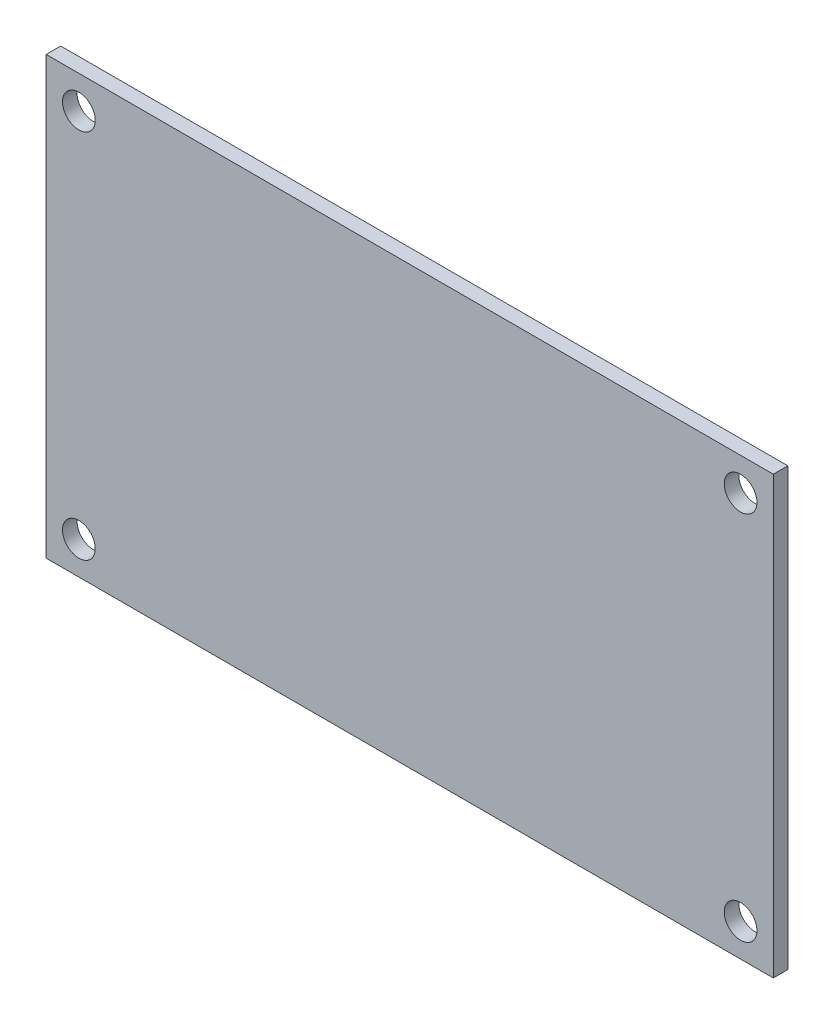
ISO-10303-21;
HEADER;
FILE_DESCRIPTION(('STEP AP214'),'2;1');
FILE_NAME('part.step','',(''),(''),'','','');
FILE_SCHEMA(('AUTOMOTIVE_DESIGN { 1 0 10303 214 1 1 1 1 }'));
ENDSEC;
DATA;
#1=APPLICATION_CONTEXT('core data for automotive mechanical design processes');
#2=APPLICATION_PROTOCOL_DEFINITION('international standard','automotive_design',2000,#1);
#3=PRODUCT_CONTEXT('',#1,'mechanical');
#4=PRODUCT('Part','Part','',(#3));
#5=PRODUCT_RELATED_PRODUCT_CATEGORY('part','',(#4));
#6=PRODUCT_DEFINITION_FORMATION('','',#4);
#7=PRODUCT_DEFINITION_CONTEXT('part definition',#1,'design');
#8=PRODUCT_DEFINITION('design','',#6,#7);
#9=PRODUCT_DEFINITION_SHAPE('','',#8);
#10=(LENGTH_UNIT() NAMED_UNIT(*) SI_UNIT(.MILLI.,.METRE.));
#11=(NAMED_UNIT(*) PLANE_ANGLE_UNIT() SI_UNIT($,.RADIAN.));
#12=(NAMED_UNIT(*) SI_UNIT($,.STERADIAN.) SOLID_ANGLE_UNIT());
#13=UNCERTAINTY_MEASURE_WITH_UNIT(LENGTH_MEASURE(1.E-05),#10,'distance_accuracy_value','');
#14=(GEOMETRIC_REPRESENTATION_CONTEXT(3) GLOBAL_UNCERTAINTY_ASSIGNED_CONTEXT((#13)) GLOBAL_UNIT_ASSIGNED_CONTEXT((#10,
#11,#12)) REPRESENTATION_CONTEXT('',''));
#15=CARTESIAN_POINT('',(0.,0.,0.));
#16=DIRECTION('',(0.,0.,1.));
#17=DIRECTION('',(1.,0.,0.));
#18=AXIS2_PLACEMENT_3D('',#15,#16,#17);
#19=CARTESIAN_POINT('',(-50.,30.,2.));
#20=DIRECTION('',(1.,0.,0.));
#21=DIRECTION('',(0.,0.,-1.));
#22=AXIS2_PLACEMENT_3D('',#19,#20,#21);
#23=PLANE('',#22);
#24=DIRECTION('',(0.,-1.,0.));
#25=VECTOR('',#24,1.);
#26=CARTESIAN_POINT('',(-50.,30.,0.));
#27=LINE('',#26,#25);
#28=CARTESIAN_POINT('',(-50.,30.,0.));
#29=VERTEX_POINT('',#28);
#30=CARTESIAN_POINT('',(-50.,-30.,0.));
#31=VERTEX_POINT('',#30);
#32=EDGE_CURVE('E100',#29,#31,#27,.T.);
#33=ORIENTED_EDGE('',*,*,#32,.T.);
#34=DIRECTION('',(0.,0.,-1.));
#35=VECTOR('',#34,1.);
#36=CARTESIAN_POINT('',(-50.,-30.,2.));
#37=LINE('',#36,#35);
#38=CARTESIAN_POINT('',(-50.,-30.,2.));
#39=VERTEX_POINT('',#38);
#40=EDGE_CURVE('E11',#39,#31,#37,.T.);
#41=ORIENTED_EDGE('',*,*,#40,.F.);
#42=DIRECTION('',(0.,-1.,0.));
#43=VECTOR('',#42,1.);
#44=CARTESIAN_POINT('',(-50.,30.,2.));
#45=LINE('',#44,#43);
#46=CARTESIAN_POINT('',(-50.,30.,2.));
#47=VERTEX_POINT('',#46);
#48=EDGE_CURVE('E86',#47,#39,#45,.T.);
#49=ORIENTED_EDGE('',*,*,#48,.F.);
#50=DIRECTION('',(0.,0.,-1.));
#51=VECTOR('',#50,1.);
#52=CARTESIAN_POINT('',(-50.,30.,2.));
#53=LINE('',#52,#51);
#54=EDGE_CURVE('E53',#47,#29,#53,.T.);
#55=ORIENTED_EDGE('',*,*,#54,.T.);
#56=EDGE_LOOP('',(#33,#41,#49,#55));
#57=FACE_BOUND('',#56,.T.);
#58=ADVANCED_FACE('F37',(#57),#23,.F.);
#59=CARTESIAN_POINT('',(-50.,-30.,2.));
#60=DIRECTION('',(0.,1.,0.));
#61=DIRECTION('',(0.,0.,1.));
#62=AXIS2_PLACEMENT_3D('',#59,#60,#61);
#63=PLANE('',#62);
#64=DIRECTION('',(1.,0.,0.));
#65=VECTOR('',#64,1.);
#66=CARTESIAN_POINT('',(-50.,-30.,0.));
#67=LINE('',#66,#65);
#68=CARTESIAN_POINT('',(50.,-30.,0.));
#69=VERTEX_POINT('',#68);
#70=EDGE_CURVE('E91',#31,#69,#67,.T.);
#71=ORIENTED_EDGE('',*,*,#70,.T.);
#72=DIRECTION('',(0.,0.,-1.));
#73=VECTOR('',#72,1.);
#74=CARTESIAN_POINT('',(50.,-30.,2.));
#75=LINE('',#74,#73);
#76=CARTESIAN_POINT('',(50.,-30.,2.));
#77=VERTEX_POINT('',#76);
#78=EDGE_CURVE('E45',#77,#69,#75,.T.);
#79=ORIENTED_EDGE('',*,*,#78,.F.);
#80=DIRECTION('',(1.,0.,0.));
#81=VECTOR('',#80,1.);
#82=CARTESIAN_POINT('',(-50.,-30.,2.));
#83=LINE('',#82,#81);
#84=EDGE_CURVE('E78',#39,#77,#83,.T.);
#85=ORIENTED_EDGE('',*,*,#84,.F.);
#86=ORIENTED_EDGE('',*,*,#40,.T.);
#87=EDGE_LOOP('',(#71,#79,#85,#86));
#88=FACE_BOUND('',#87,.T.);
#89=ADVANCED_FACE('F90',(#88),#63,.F.);
#90=CARTESIAN_POINT('',(50.,30.,2.));
#91=DIRECTION('',(1.,0.,0.));
#92=DIRECTION('',(0.,0.,-1.));
#93=AXIS2_PLACEMENT_3D('',#90,#91,#92);
#94=PLANE('',#93);
#95=DIRECTION('',(0.,-1.,0.));
#96=VECTOR('',#95,1.);
#97=CARTESIAN_POINT('',(50.,30.,0.));
#98=LINE('',#97,#96);
#99=CARTESIAN_POINT('',(50.,30.,0.));
#100=VERTEX_POINT('',#99);
#101=EDGE_CURVE('E104',#100,#69,#98,.T.);
#102=ORIENTED_EDGE('',*,*,#101,.F.);
#103=DIRECTION('',(0.,0.,-1.));
#104=VECTOR('',#103,1.);
#105=CARTESIAN_POINT('',(50.,30.,2.));
#106=LINE('',#105,#104);
#107=CARTESIAN_POINT('',(50.,30.,2.));
#108=VERTEX_POINT('',#107);
#109=EDGE_CURVE('E67',#108,#100,#106,.T.);
#110=ORIENTED_EDGE('',*,*,#109,.F.);
#111=DIRECTION('',(0.,-1.,0.));
#112=VECTOR('',#111,1.);
#113=CARTESIAN_POINT('',(50.,30.,2.));
#114=LINE('',#113,#112);
#115=EDGE_CURVE('E85',#108,#77,#114,.T.);
#116=ORIENTED_EDGE('',*,*,#115,.T.);
#117=ORIENTED_EDGE('',*,*,#78,.T.);
#118=EDGE_LOOP('',(#102,#110,#116,#117));
#119=FACE_BOUND('',#118,.T.);
#120=ADVANCED_FACE('F94',(#119),#94,.T.);
#121=CARTESIAN_POINT('',(-50.,30.,2.));
#122=DIRECTION('',(0.,1.,0.));
#123=DIRECTION('',(0.,0.,1.));
#124=AXIS2_PLACEMENT_3D('',#121,#122,#123);
#125=PLANE('',#124);
#126=DIRECTION('',(1.,0.,0.));
#127=VECTOR('',#126,1.);
#128=CARTESIAN_POINT('',(-50.,30.,0.));
#129=LINE('',#128,#127);
#130=EDGE_CURVE('E106',#29,#100,#129,.T.);
#131=ORIENTED_EDGE('',*,*,#130,.F.);
#132=ORIENTED_EDGE('',*,*,#54,.F.);
#133=DIRECTION('',(1.,0.,0.));
#134=VECTOR('',#133,1.);
#135=CARTESIAN_POINT('',(-50.,30.,2.));
#136=LINE('',#135,#134);
#137=EDGE_CURVE('E95',#47,#108,#136,.T.);
#138=ORIENTED_EDGE('',*,*,#137,.T.);
#139=ORIENTED_EDGE('',*,*,#109,.T.);
#140=EDGE_LOOP('',(#131,#132,#138,#139));
#141=FACE_BOUND('',#140,.T.);
#142=ADVANCED_FACE('F141',(#141),#125,.T.);
#143=CARTESIAN_POINT('',(0.,0.,2.));
#144=DIRECTION('',(0.,0.,1.));
#145=DIRECTION('',(1.,0.,0.));
#146=AXIS2_PLACEMENT_3D('',#143,#144,#145);
#147=PLANE('',#146);
#148=CARTESIAN_POINT('',(-45.5,25.5,2.));
#149=DIRECTION('',(0.,0.,1.));
#150=DIRECTION('',(1.,0.,0.));
#151=AXIS2_PLACEMENT_3D('',#148,#149,#150);
#152=CIRCLE('',#151,2.24999999999999);
#153=CARTESIAN_POINT('',(-43.25,25.5,2.));
#154=VERTEX_POINT('',#153);
#155=EDGE_CURVE('E132',#154,#154,#152,.T.);
#156=ORIENTED_EDGE('',*,*,#155,.F.);
#157=EDGE_LOOP('',(#156));
#158=FACE_BOUND('',#157,.T.);
#159=CARTESIAN_POINT('',(-45.5,-25.5,2.));
#160=DIRECTION('',(0.,0.,1.));
#161=DIRECTION('',(1.,0.,0.));
#162=AXIS2_PLACEMENT_3D('',#159,#160,#161);
#163=CIRCLE('',#162,2.24999999999999);
#164=CARTESIAN_POINT('',(-43.25,-25.5,2.));
#165=VERTEX_POINT('',#164);
#166=EDGE_CURVE('E126',#165,#165,#163,.T.);
#167=ORIENTED_EDGE('',*,*,#166,.F.);
#168=EDGE_LOOP('',(#167));
#169=FACE_BOUND('',#168,.T.);
#170=CARTESIAN_POINT('',(45.5,-25.5,2.));
#171=DIRECTION('',(0.,0.,1.));
#172=DIRECTION('',(1.,0.,0.));
#173=AXIS2_PLACEMENT_3D('',#170,#171,#172);
#174=CIRCLE('',#173,2.24999999999999);
#175=CARTESIAN_POINT('',(47.75,-25.5,2.));
#176=VERTEX_POINT('',#175);
#177=EDGE_CURVE('E120',#176,#176,#174,.T.);
#178=ORIENTED_EDGE('',*,*,#177,.F.);
#179=EDGE_LOOP('',(#178));
#180=FACE_BOUND('',#179,.T.);
#181=CARTESIAN_POINT('',(45.5,25.5,2.));
#182=DIRECTION('',(0.,0.,1.));
#183=DIRECTION('',(1.,0.,0.));
#184=AXIS2_PLACEMENT_3D('',#181,#182,#183);
#185=CIRCLE('',#184,2.24999999999999);
#186=CARTESIAN_POINT('',(47.75,25.5,2.));
#187=VERTEX_POINT('',#186);
#188=EDGE_CURVE('E114',#187,#187,#185,.T.);
#189=ORIENTED_EDGE('',*,*,#188,.F.);
#190=EDGE_LOOP('',(#189));
#191=FACE_BOUND('',#190,.T.);
#192=ORIENTED_EDGE('',*,*,#48,.T.);
#193=ORIENTED_EDGE('',*,*,#84,.T.);
#194=ORIENTED_EDGE('',*,*,#115,.F.);
#195=ORIENTED_EDGE('',*,*,#137,.F.);
#196=EDGE_LOOP('',(#192,#193,#194,#195));
#197=FACE_BOUND('',#196,.T.);
#198=ADVANCED_FACE('F82',(#158,#169,#180,#191,#197),#147,.T.);
#199=CARTESIAN_POINT('',(0.,0.,0.));
#200=DIRECTION('',(0.,0.,1.));
#201=DIRECTION('',(1.,0.,0.));
#202=AXIS2_PLACEMENT_3D('',#199,#200,#201);
#203=PLANE('',#202);
#204=CARTESIAN_POINT('',(-45.5,25.5,0.));
#205=DIRECTION('',(0.,0.,1.));
#206=DIRECTION('',(1.,0.,0.));
#207=AXIS2_PLACEMENT_3D('',#204,#205,#206);
#208=CIRCLE('',#207,2.25);
#209=CARTESIAN_POINT('',(-43.25,25.5,0.));
#210=VERTEX_POINT('',#209);
#211=EDGE_CURVE('E129',#210,#210,#208,.T.);
#212=ORIENTED_EDGE('',*,*,#211,.T.);
#213=EDGE_LOOP('',(#212));
#214=FACE_BOUND('',#213,.T.);
#215=CARTESIAN_POINT('',(-45.5,-25.5,0.));
#216=DIRECTION('',(0.,0.,1.));
#217=DIRECTION('',(1.,0.,0.));
#218=AXIS2_PLACEMENT_3D('',#215,#216,#217);
#219=CIRCLE('',#218,2.25);
#220=CARTESIAN_POINT('',(-43.25,-25.5,0.));
#221=VERTEX_POINT('',#220);
#222=EDGE_CURVE('E123',#221,#221,#219,.T.);
#223=ORIENTED_EDGE('',*,*,#222,.T.);
#224=EDGE_LOOP('',(#223));
#225=FACE_BOUND('',#224,.T.);
#226=CARTESIAN_POINT('',(45.5,-25.5,0.));
#227=DIRECTION('',(0.,0.,1.));
#228=DIRECTION('',(1.,0.,0.));
#229=AXIS2_PLACEMENT_3D('',#226,#227,#228);
#230=CIRCLE('',#229,2.25);
#231=CARTESIAN_POINT('',(47.75,-25.5,0.));
#232=VERTEX_POINT('',#231);
#233=EDGE_CURVE('E117',#232,#232,#230,.T.);
#234=ORIENTED_EDGE('',*,*,#233,.T.);
#235=EDGE_LOOP('',(#234));
#236=FACE_BOUND('',#235,.T.);
#237=CARTESIAN_POINT('',(45.5,25.5,0.));
#238=DIRECTION('',(0.,0.,1.));
#239=DIRECTION('',(1.,0.,0.));
#240=AXIS2_PLACEMENT_3D('',#237,#238,#239);
#241=CIRCLE('',#240,2.25);
#242=CARTESIAN_POINT('',(47.75,25.5,0.));
#243=VERTEX_POINT('',#242);
#244=EDGE_CURVE('E102',#243,#243,#241,.T.);
#245=ORIENTED_EDGE('',*,*,#244,.T.);
#246=EDGE_LOOP('',(#245));
#247=FACE_BOUND('',#246,.T.);
#248=ORIENTED_EDGE('',*,*,#32,.F.);
#249=ORIENTED_EDGE('',*,*,#130,.T.);
#250=ORIENTED_EDGE('',*,*,#101,.T.);
#251=ORIENTED_EDGE('',*,*,#70,.F.);
#252=EDGE_LOOP('',(#248,#249,#250,#251));
#253=FACE_BOUND('',#252,.T.);
#254=ADVANCED_FACE('F140',(#214,#225,#236,#247,#253),#203,.F.);
#255=CARTESIAN_POINT('',(45.5,25.5,2.));
#256=DIRECTION('',(0.,0.,1.));
#257=DIRECTION('',(1.,0.,0.));
#258=AXIS2_PLACEMENT_3D('',#255,#256,#257);
#259=CYLINDRICAL_SURFACE('',#258,2.24999999999999);
#260=ORIENTED_EDGE('',*,*,#244,.F.);
#261=EDGE_LOOP('',(#260));
#262=FACE_BOUND('',#261,.T.);
#263=ORIENTED_EDGE('',*,*,#188,.T.);
#264=EDGE_LOOP('',(#263));
#265=FACE_BOUND('',#264,.T.);
#266=ADVANCED_FACE('F149',(#262,#265),#259,.F.);
#267=CARTESIAN_POINT('',(45.5,-25.5,2.));
#268=DIRECTION('',(0.,0.,1.));
#269=DIRECTION('',(1.,0.,0.));
#270=AXIS2_PLACEMENT_3D('',#267,#268,#269);
#271=CYLINDRICAL_SURFACE('',#270,2.24999999999999);
#272=ORIENTED_EDGE('',*,*,#233,.F.);
#273=EDGE_LOOP('',(#272));
#274=FACE_BOUND('',#273,.T.);
#275=ORIENTED_EDGE('',*,*,#177,.T.);
#276=EDGE_LOOP('',(#275));
#277=FACE_BOUND('',#276,.T.);
#278=ADVANCED_FACE('F151',(#274,#277),#271,.F.);
#279=CARTESIAN_POINT('',(-45.5,-25.5,2.));
#280=DIRECTION('',(0.,0.,1.));
#281=DIRECTION('',(1.,0.,0.));
#282=AXIS2_PLACEMENT_3D('',#279,#280,#281);
#283=CYLINDRICAL_SURFACE('',#282,2.24999999999999);
#284=ORIENTED_EDGE('',*,*,#222,.F.);
#285=EDGE_LOOP('',(#284));
#286=FACE_BOUND('',#285,.T.);
#287=ORIENTED_EDGE('',*,*,#166,.T.);
#288=EDGE_LOOP('',(#287));
#289=FACE_BOUND('',#288,.T.);
#290=ADVANCED_FACE('F158',(#286,#289),#283,.F.);
#291=CARTESIAN_POINT('',(-45.5,25.5,2.));
#292=DIRECTION('',(0.,0.,1.));
#293=DIRECTION('',(1.,0.,0.));
#294=AXIS2_PLACEMENT_3D('',#291,#292,#293);
#295=CYLINDRICAL_SURFACE('',#294,2.24999999999999);
#296=ORIENTED_EDGE('',*,*,#211,.F.);
#297=EDGE_LOOP('',(#296));
#298=FACE_BOUND('',#297,.T.);
#299=ORIENTED_EDGE('',*,*,#155,.T.);
#300=EDGE_LOOP('',(#299));
#301=FACE_BOUND('',#300,.T.);
#302=ADVANCED_FACE('F136',(#298,#301),#295,.F.);
#303=CLOSED_SHELL('',(#58,#89,#120,#142,#198,#254,#266,#278,#290,#302));
#304=MANIFOLD_SOLID_BREP('B2',#303);
#305=ADVANCED_BREP_SHAPE_REPRESENTATION('',(#18,#304),#14);
#306=SHAPE_DEFINITION_REPRESENTATION(#9,#305);
ENDSEC;
END-ISO-10303-21;
